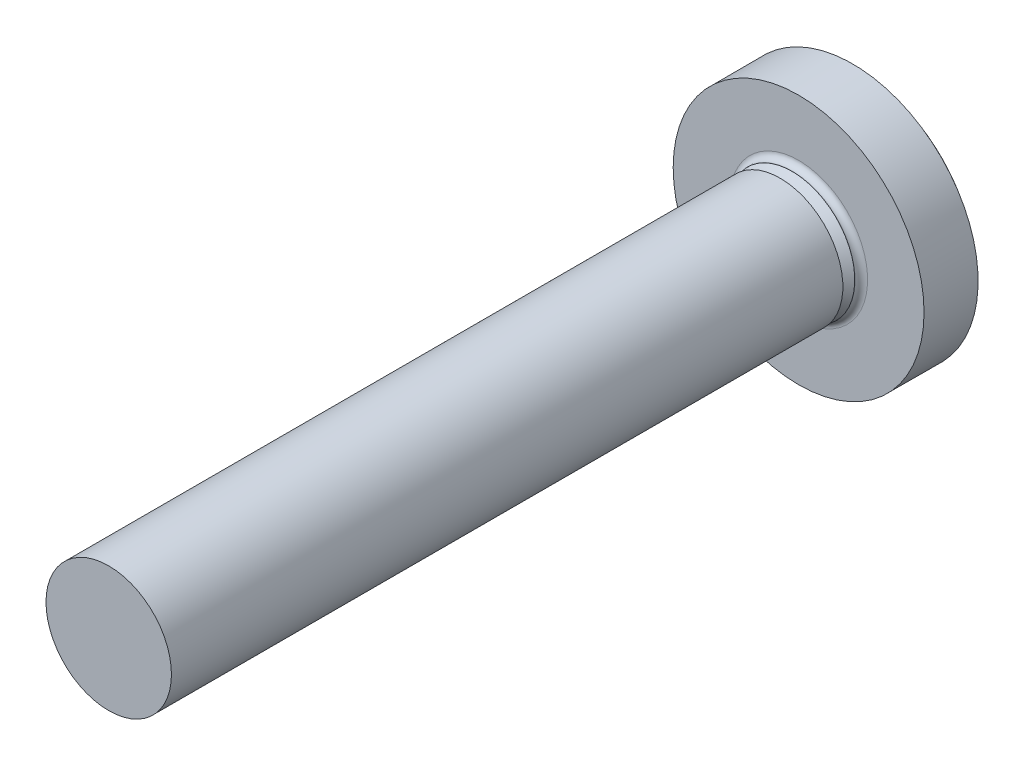
ISO-10303-21;
HEADER;
FILE_DESCRIPTION(('STEP AP214'),'2;1');
FILE_NAME('part.step','',(''),(''),'','','');
FILE_SCHEMA(('AUTOMOTIVE_DESIGN { 1 0 10303 214 1 1 1 1 }'));
ENDSEC;
DATA;
#1=APPLICATION_CONTEXT('core data for automotive mechanical design processes');
#2=APPLICATION_PROTOCOL_DEFINITION('international standard','automotive_design',2000,#1);
#3=PRODUCT_CONTEXT('',#1,'mechanical');
#4=PRODUCT('Part','Part','',(#3));
#5=PRODUCT_RELATED_PRODUCT_CATEGORY('part','',(#4));
#6=PRODUCT_DEFINITION_FORMATION('','',#4);
#7=PRODUCT_DEFINITION_CONTEXT('part definition',#1,'design');
#8=PRODUCT_DEFINITION('design','',#6,#7);
#9=PRODUCT_DEFINITION_SHAPE('','',#8);
#10=(LENGTH_UNIT() NAMED_UNIT(*) SI_UNIT(.MILLI.,.METRE.));
#11=(NAMED_UNIT(*) PLANE_ANGLE_UNIT() SI_UNIT($,.RADIAN.));
#12=(NAMED_UNIT(*) SI_UNIT($,.STERADIAN.) SOLID_ANGLE_UNIT());
#13=UNCERTAINTY_MEASURE_WITH_UNIT(LENGTH_MEASURE(1.E-05),#10,'distance_accuracy_value','');
#14=(GEOMETRIC_REPRESENTATION_CONTEXT(3) GLOBAL_UNCERTAINTY_ASSIGNED_CONTEXT((#13)) GLOBAL_UNIT_ASSIGNED_CONTEXT((#10,
#11,#12)) REPRESENTATION_CONTEXT('',''));
#15=CARTESIAN_POINT('',(0.,0.,0.));
#16=DIRECTION('',(0.,0.,1.));
#17=DIRECTION('',(1.,0.,0.));
#18=AXIS2_PLACEMENT_3D('',#15,#16,#17);
#19=CARTESIAN_POINT('',(0.,0.,0.));
#20=DIRECTION('',(0.,0.,-1.));
#21=DIRECTION('',(-1.,0.,0.));
#22=AXIS2_PLACEMENT_3D('',#19,#20,#21);
#23=CYLINDRICAL_SURFACE('',#22,2.);
#24=CARTESIAN_POINT('',(0.,0.,3.688875));
#25=DIRECTION('',(0.,0.,-1.));
#26=DIRECTION('',(-1.,0.,0.));
#27=AXIS2_PLACEMENT_3D('',#24,#25,#26);
#28=CIRCLE('',#27,2.);
#29=CARTESIAN_POINT('',(-2.,0.,3.688875));
#30=VERTEX_POINT('',#29);
#31=EDGE_CURVE('E204',#30,#30,#28,.T.);
#32=ORIENTED_EDGE('',*,*,#31,.F.);
#33=EDGE_LOOP('',(#32));
#34=FACE_BOUND('',#33,.T.);
#35=CARTESIAN_POINT('',(0.,0.,25.1));
#36=DIRECTION('',(0.,0.,1.));
#37=DIRECTION('',(1.,0.,0.));
#38=AXIS2_PLACEMENT_3D('',#35,#36,#37);
#39=CIRCLE('',#38,2.);
#40=CARTESIAN_POINT('',(2.,0.,25.1));
#41=VERTEX_POINT('',#40);
#42=EDGE_CURVE('E37',#41,#41,#39,.T.);
#43=ORIENTED_EDGE('',*,*,#42,.F.);
#44=EDGE_LOOP('',(#43));
#45=FACE_BOUND('',#44,.T.);
#46=ADVANCED_FACE('F34',(#34,#45),#23,.T.);
#47=CARTESIAN_POINT('',(0.,0.,6.5));
#48=DIRECTION('',(0.,0.,-1.));
#49=DIRECTION('',(0.,1.,0.));
#50=AXIS2_PLACEMENT_3D('',#47,#48,#49);
#51=SPHERICAL_SURFACE('',#50,6.5);
#52=CARTESIAN_POINT('',(0.,0.,1.3765246170202));
#53=DIRECTION('',(0.,0.,-1.));
#54=DIRECTION('',(-1.,0.,0.));
#55=AXIS2_PLACEMENT_3D('',#52,#53,#54);
#56=CIRCLE('',#55,4.);
#57=CARTESIAN_POINT('',(-4.,0.,1.3765246170202));
#58=VERTEX_POINT('',#57);
#59=EDGE_CURVE('E179',#58,#58,#56,.T.);
#60=ORIENTED_EDGE('',*,*,#59,.T.);
#61=EDGE_LOOP('',(#60));
#62=FACE_BOUND('',#61,.T.);
#63=CARTESIAN_POINT('',(-0.405545392562274,0.189108922281263,6.3801008200685));
#64=DIRECTION('',(-0.875426098065593,0.408217893676735,-0.258819045102521));
#65=DIRECTION('',(-0.422618261740699,-0.90630778703665,0.));
#66=AXIS2_PLACEMENT_3D('',#63,#64,#65);
#67=CIRCLE('',#66,6.48347090197349);
#68=CARTESIAN_POINT('',(0.92299563807694,-0.92299563807694,0.132413478861721));
#69=VERTEX_POINT('',#68);
#70=CARTESIAN_POINT('',(0.305622674506346,-2.10418012593627,0.35760463838069));
#71=VERTEX_POINT('',#70);
#72=EDGE_CURVE('E11',#69,#71,#67,.T.);
#73=ORIENTED_EDGE('',*,*,#72,.F.);
#74=CARTESIAN_POINT('',(-0.189108922281263,0.405545392562274,6.3801008200685));
#75=DIRECTION('',(-0.408217893676735,0.875426098065593,-0.258819045102521));
#76=DIRECTION('',(-0.90630778703665,-0.422618261740699,0.));
#77=AXIS2_PLACEMENT_3D('',#74,#75,#76);
#78=CIRCLE('',#77,6.48347090197349);
#79=CARTESIAN_POINT('',(2.10418012593627,-0.305622674506346,0.357604638380691));
#80=VERTEX_POINT('',#79);
#81=EDGE_CURVE('E43',#80,#69,#78,.T.);
#82=ORIENTED_EDGE('',*,*,#81,.F.);
#83=CARTESIAN_POINT('',(0.427627944162883,0.,6.61458256229943));
#84=DIRECTION('',(-0.965925826289068,0.,-0.258819045102521));
#85=DIRECTION('',(-0.258819045102521,0.,0.965925826289068));
#86=AXIS2_PLACEMENT_3D('',#83,#84,#85);
#87=CIRCLE('',#86,6.48490594980281);
#88=CARTESIAN_POINT('',(2.10418012593627,0.305622674506346,0.357604638380691));
#89=VERTEX_POINT('',#88);
#90=EDGE_CURVE('E235',#89,#80,#87,.T.);
#91=ORIENTED_EDGE('',*,*,#90,.F.);
#92=CARTESIAN_POINT('',(-0.189108922281263,-0.405545392562275,6.3801008200685));
#93=DIRECTION('',(-0.408217893676735,-0.875426098065593,-0.258819045102521));
#94=DIRECTION('',(0.90630778703665,-0.422618261740699,0.));
#95=AXIS2_PLACEMENT_3D('',#92,#93,#94);
#96=CIRCLE('',#95,6.48347090197349);
#97=CARTESIAN_POINT('',(0.922995638076941,0.922995638076939,0.132413478861721));
#98=VERTEX_POINT('',#97);
#99=EDGE_CURVE('E232',#98,#89,#96,.T.);
#100=ORIENTED_EDGE('',*,*,#99,.F.);
#101=CARTESIAN_POINT('',(-0.405545392562273,-0.189108922281263,6.3801008200685));
#102=DIRECTION('',(-0.875426098065593,-0.408217893676735,-0.258819045102521));
#103=DIRECTION('',(0.422618261740699,-0.90630778703665,0.));
#104=AXIS2_PLACEMENT_3D('',#101,#102,#103);
#105=CIRCLE('',#104,6.48347090197349);
#106=CARTESIAN_POINT('',(0.305622674506346,2.10418012593627,0.35760463838069));
#107=VERTEX_POINT('',#106);
#108=EDGE_CURVE('E229',#107,#98,#105,.T.);
#109=ORIENTED_EDGE('',*,*,#108,.F.);
#110=CARTESIAN_POINT('',(0.,0.427627944162883,6.61458256229943));
#111=DIRECTION('',(0.,-0.965925826289068,-0.258819045102521));
#112=DIRECTION('',(0.,0.258819045102521,-0.965925826289068));
#113=AXIS2_PLACEMENT_3D('',#110,#111,#112);
#114=CIRCLE('',#113,6.48490594980281);
#115=CARTESIAN_POINT('',(-0.305622674506345,2.10418012593627,0.35760463838069));
#116=VERTEX_POINT('',#115);
#117=EDGE_CURVE('E226',#116,#107,#114,.T.);
#118=ORIENTED_EDGE('',*,*,#117,.F.);
#119=CARTESIAN_POINT('',(0.405545392562275,-0.189108922281263,6.3801008200685));
#120=DIRECTION('',(0.875426098065593,-0.408217893676735,-0.258819045102521));
#121=DIRECTION('',(0.422618261740699,0.90630778703665,0.));
#122=AXIS2_PLACEMENT_3D('',#119,#120,#121);
#123=CIRCLE('',#122,6.48347090197349);
#124=CARTESIAN_POINT('',(-0.92299563807694,0.922995638076941,0.132413478861721));
#125=VERTEX_POINT('',#124);
#126=EDGE_CURVE('E223',#125,#116,#123,.T.);
#127=ORIENTED_EDGE('',*,*,#126,.F.);
#128=CARTESIAN_POINT('',(0.189108922281263,-0.405545392562273,6.3801008200685));
#129=DIRECTION('',(0.408217893676735,-0.875426098065593,-0.258819045102521));
#130=DIRECTION('',(0.90630778703665,0.422618261740699,0.));
#131=AXIS2_PLACEMENT_3D('',#128,#129,#130);
#132=CIRCLE('',#131,6.48347090197349);
#133=CARTESIAN_POINT('',(-2.10418012593627,0.305622674506346,0.35760463838069));
#134=VERTEX_POINT('',#133);
#135=EDGE_CURVE('E220',#134,#125,#132,.T.);
#136=ORIENTED_EDGE('',*,*,#135,.F.);
#137=CARTESIAN_POINT('',(-0.427627944162883,0.,6.61458256229943));
#138=DIRECTION('',(0.965925826289068,0.,-0.258819045102521));
#139=DIRECTION('',(-0.258819045102521,0.,-0.965925826289068));
#140=AXIS2_PLACEMENT_3D('',#137,#138,#139);
#141=CIRCLE('',#140,6.48490594980281);
#142=CARTESIAN_POINT('',(-2.10418012593627,-0.305622674506345,0.357604638380691));
#143=VERTEX_POINT('',#142);
#144=EDGE_CURVE('E217',#143,#134,#141,.T.);
#145=ORIENTED_EDGE('',*,*,#144,.F.);
#146=CARTESIAN_POINT('',(0.189108922281264,0.405545392562274,6.3801008200685));
#147=DIRECTION('',(0.408217893676735,0.875426098065593,-0.258819045102521));
#148=DIRECTION('',(-0.90630778703665,0.422618261740699,0.));
#149=AXIS2_PLACEMENT_3D('',#146,#147,#148);
#150=CIRCLE('',#149,6.48347090197349);
#151=CARTESIAN_POINT('',(-0.922995638076941,-0.92299563807694,0.132413478861721));
#152=VERTEX_POINT('',#151);
#153=EDGE_CURVE('E214',#152,#143,#150,.T.);
#154=ORIENTED_EDGE('',*,*,#153,.F.);
#155=CARTESIAN_POINT('',(0.405545392562273,0.189108922281263,6.3801008200685));
#156=DIRECTION('',(0.875426098065593,0.408217893676735,-0.258819045102521));
#157=DIRECTION('',(-0.422618261740699,0.90630778703665,0.));
#158=AXIS2_PLACEMENT_3D('',#155,#156,#157);
#159=CIRCLE('',#158,6.48347090197349);
#160=CARTESIAN_POINT('',(-0.305622674506346,-2.10418012593627,0.357604638380691));
#161=VERTEX_POINT('',#160);
#162=EDGE_CURVE('E211',#161,#152,#159,.T.);
#163=ORIENTED_EDGE('',*,*,#162,.F.);
#164=CARTESIAN_POINT('',(0.,-0.427627944162883,6.61458256229943));
#165=DIRECTION('',(0.,0.965925826289068,-0.258819045102521));
#166=DIRECTION('',(0.,0.258819045102521,0.965925826289068));
#167=AXIS2_PLACEMENT_3D('',#164,#165,#166);
#168=CIRCLE('',#167,6.48490594980281);
#169=EDGE_CURVE('E208',#71,#161,#168,.T.);
#170=ORIENTED_EDGE('',*,*,#169,.F.);
#171=EDGE_LOOP('',(#73,#82,#91,#100,#109,#118,#127,#136,#145,#154,#163,#170));
#172=FACE_BOUND('',#171,.T.);
#173=ADVANCED_FACE('F258',(#62,#172),#51,.T.);
#174=CARTESIAN_POINT('',(0.,2.,3.688875));
#175=DIRECTION('',(0.,0.,1.));
#176=DIRECTION('',(1.,0.,0.));
#177=AXIS2_PLACEMENT_3D('',#174,#175,#176);
#178=PLANE('',#177);
#179=CARTESIAN_POINT('',(0.,0.,3.688875));
#180=DIRECTION('',(0.,0.,-1.));
#181=DIRECTION('',(-1.,0.,0.));
#182=AXIS2_PLACEMENT_3D('',#179,#180,#181);
#183=CIRCLE('',#182,1.621125);
#184=CARTESIAN_POINT('',(-1.621125,0.,3.688875));
#185=VERTEX_POINT('',#184);
#186=EDGE_CURVE('E200',#185,#185,#183,.T.);
#187=ORIENTED_EDGE('',*,*,#186,.F.);
#188=EDGE_LOOP('',(#187));
#189=FACE_BOUND('',#188,.T.);
#190=ORIENTED_EDGE('',*,*,#31,.T.);
#191=EDGE_LOOP('',(#190));
#192=FACE_BOUND('',#191,.T.);
#193=ADVANCED_FACE('F253',(#189,#192),#178,.F.);
#194=CARTESIAN_POINT('',(0.,0.,3.688875));
#195=DIRECTION('',(0.,0.,-1.));
#196=DIRECTION('',(-1.,0.,0.));
#197=AXIS2_PLACEMENT_3D('',#194,#195,#196);
#198=CONICAL_SURFACE('',#197,1.621125,0.785398163397449);
#199=CARTESIAN_POINT('',(0.,0.,3.31));
#200=DIRECTION('',(0.,0.,-1.));
#201=DIRECTION('',(-1.,0.,0.));
#202=AXIS2_PLACEMENT_3D('',#199,#200,#201);
#203=CIRCLE('',#202,2.);
#204=CARTESIAN_POINT('',(-2.,0.,3.31));
#205=VERTEX_POINT('',#204);
#206=EDGE_CURVE('E196',#205,#205,#203,.T.);
#207=ORIENTED_EDGE('',*,*,#206,.F.);
#208=EDGE_LOOP('',(#207));
#209=FACE_BOUND('',#208,.T.);
#210=ORIENTED_EDGE('',*,*,#186,.T.);
#211=EDGE_LOOP('',(#210));
#212=FACE_BOUND('',#211,.T.);
#213=ADVANCED_FACE('F257',(#209,#212),#198,.T.);
#214=CARTESIAN_POINT('',(0.,0.,0.));
#215=DIRECTION('',(0.,0.,-1.));
#216=DIRECTION('',(-1.,0.,0.));
#217=AXIS2_PLACEMENT_3D('',#214,#215,#216);
#218=CYLINDRICAL_SURFACE('',#217,2.);
#219=CARTESIAN_POINT('',(0.,0.,3.3));
#220=DIRECTION('',(0.,0.,-1.));
#221=DIRECTION('',(-1.,0.,0.));
#222=AXIS2_PLACEMENT_3D('',#219,#220,#221);
#223=CIRCLE('',#222,2.);
#224=CARTESIAN_POINT('',(-2.,0.,3.3));
#225=VERTEX_POINT('',#224);
#226=EDGE_CURVE('E192',#225,#225,#223,.T.);
#227=ORIENTED_EDGE('',*,*,#226,.F.);
#228=EDGE_LOOP('',(#227));
#229=FACE_BOUND('',#228,.T.);
#230=ORIENTED_EDGE('',*,*,#206,.T.);
#231=EDGE_LOOP('',(#230));
#232=FACE_BOUND('',#231,.T.);
#233=ADVANCED_FACE('F267',(#229,#232),#218,.T.);
#234=CARTESIAN_POINT('',(0.,0.,3.3));
#235=DIRECTION('',(0.,0.,-1.));
#236=DIRECTION('',(-1.,0.,0.));
#237=AXIS2_PLACEMENT_3D('',#234,#235,#236);
#238=TOROIDAL_SURFACE('',#237,2.2,0.2);
#239=ORIENTED_EDGE('',*,*,#226,.T.);
#240=EDGE_LOOP('',(#239));
#241=FACE_BOUND('',#240,.T.);
#242=CARTESIAN_POINT('',(0.,0.,3.1));
#243=DIRECTION('',(0.,0.,-1.));
#244=DIRECTION('',(-1.,0.,0.));
#245=AXIS2_PLACEMENT_3D('',#242,#243,#244);
#246=CIRCLE('',#245,2.2);
#247=CARTESIAN_POINT('',(-2.2,0.,3.1));
#248=VERTEX_POINT('',#247);
#249=EDGE_CURVE('E188',#248,#248,#246,.T.);
#250=ORIENTED_EDGE('',*,*,#249,.F.);
#251=EDGE_LOOP('',(#250));
#252=FACE_BOUND('',#251,.T.);
#253=ADVANCED_FACE('F277',(#241,#252),#238,.F.);
#254=CARTESIAN_POINT('',(0.,2.2,3.1));
#255=DIRECTION('',(0.,0.,-1.));
#256=DIRECTION('',(-1.,0.,0.));
#257=AXIS2_PLACEMENT_3D('',#254,#255,#256);
#258=PLANE('',#257);
#259=CARTESIAN_POINT('',(0.,0.,3.1));
#260=DIRECTION('',(0.,0.,-1.));
#261=DIRECTION('',(-1.,0.,0.));
#262=AXIS2_PLACEMENT_3D('',#259,#260,#261);
#263=CIRCLE('',#262,4.);
#264=CARTESIAN_POINT('',(-4.,0.,3.1));
#265=VERTEX_POINT('',#264);
#266=EDGE_CURVE('E183',#265,#265,#263,.T.);
#267=ORIENTED_EDGE('',*,*,#266,.F.);
#268=EDGE_LOOP('',(#267));
#269=FACE_BOUND('',#268,.T.);
#270=ORIENTED_EDGE('',*,*,#249,.T.);
#271=EDGE_LOOP('',(#270));
#272=FACE_BOUND('',#271,.T.);
#273=ADVANCED_FACE('F287',(#269,#272),#258,.F.);
#274=CARTESIAN_POINT('',(0.,0.,0.));
#275=DIRECTION('',(0.,0.,-1.));
#276=DIRECTION('',(-1.,0.,0.));
#277=AXIS2_PLACEMENT_3D('',#274,#275,#276);
#278=CYLINDRICAL_SURFACE('',#277,4.);
#279=ORIENTED_EDGE('',*,*,#59,.F.);
#280=EDGE_LOOP('',(#279));
#281=FACE_BOUND('',#280,.T.);
#282=ORIENTED_EDGE('',*,*,#266,.T.);
#283=EDGE_LOOP('',(#282));
#284=FACE_BOUND('',#283,.T.);
#285=ADVANCED_FACE('F297',(#281,#284),#278,.T.);
#286=CARTESIAN_POINT('',(0.366666666666667,-2.2,0.));
#287=DIRECTION('',(-0.875426098065593,0.408217893676735,-0.258819045102521));
#288=DIRECTION('',(-0.422618261740699,-0.90630778703665,0.));
#289=AXIS2_PLACEMENT_3D('',#286,#287,#288);
#290=PLANE('',#289);
#291=ORIENTED_EDGE('',*,*,#72,.T.);
#292=DIRECTION('',(0.162689201767992,-0.255370893567974,-0.953057149569945));
#293=VECTOR('',#292,1.);
#294=CARTESIAN_POINT('',(0.366666666666667,-2.2,0.));
#295=LINE('',#294,#293);
#296=CARTESIAN_POINT('',(0.0423319890466869,-1.69089653438087,1.9));
#297=VERTEX_POINT('',#296);
#298=EDGE_CURVE('E50',#297,#71,#295,.T.);
#299=ORIENTED_EDGE('',*,*,#298,.F.);
#300=DIRECTION('',(0.422618261740699,0.90630778703665,0.));
#301=VECTOR('',#300,1.);
#302=CARTESIAN_POINT('',(0.149047069992156,-1.46204530477057,1.9));
#303=LINE('',#302,#301);
#304=CARTESIAN_POINT('',(0.566600049829658,-0.566600049829659,1.9));
#305=VERTEX_POINT('',#304);
#306=EDGE_CURVE('E136',#297,#305,#303,.T.);
#307=ORIENTED_EDGE('',*,*,#306,.T.);
#308=DIRECTION('',(0.193899607686987,-0.193899607686987,-0.961668281829896));
#309=VECTOR('',#308,1.);
#310=CARTESIAN_POINT('',(0.974781670177971,-0.974781670177972,-0.12442553751102));
#311=LINE('',#310,#309);
#312=EDGE_CURVE('E184',#305,#69,#311,.T.);
#313=ORIENTED_EDGE('',*,*,#312,.T.);
#314=EDGE_LOOP('',(#291,#299,#307,#313));
#315=FACE_BOUND('',#314,.T.);
#316=ADVANCED_FACE('F135',(#315),#290,.T.);
#317=CARTESIAN_POINT('',(0.949693951922647,-0.949693951922649,0.));
#318=DIRECTION('',(-0.408217893676735,0.875426098065593,-0.258819045102521));
#319=DIRECTION('',(-0.90630778703665,-0.422618261740699,0.));
#320=AXIS2_PLACEMENT_3D('',#317,#318,#319);
#321=PLANE('',#320);
#322=ORIENTED_EDGE('',*,*,#81,.T.);
#323=ORIENTED_EDGE('',*,*,#312,.F.);
#324=DIRECTION('',(0.90630778703665,0.422618261740699,0.));
#325=VECTOR('',#324,1.);
#326=CARTESIAN_POINT('',(0.177234242228863,-0.748164307737616,1.9));
#327=LINE('',#326,#325);
#328=CARTESIAN_POINT('',(1.69089653438087,-0.0423319890466872,1.9));
#329=VERTEX_POINT('',#328);
#330=EDGE_CURVE('E143',#305,#329,#327,.T.);
#331=ORIENTED_EDGE('',*,*,#330,.T.);
#332=DIRECTION('',(0.255370893567974,-0.162689201767992,-0.953057149569945));
#333=VECTOR('',#332,1.);
#334=CARTESIAN_POINT('',(2.2,-0.366666666666667,0.));
#335=LINE('',#334,#333);
#336=EDGE_CURVE('E558',#329,#80,#335,.T.);
#337=ORIENTED_EDGE('',*,*,#336,.T.);
#338=EDGE_LOOP('',(#322,#323,#331,#337));
#339=FACE_BOUND('',#338,.T.);
#340=ADVANCED_FACE('F315',(#339),#321,.T.);
#341=CARTESIAN_POINT('',(2.2,-0.366666666666667,0.));
#342=DIRECTION('',(-0.965925826289068,0.,-0.258819045102521));
#343=DIRECTION('',(-0.258819045102521,0.,0.965925826289068));
#344=AXIS2_PLACEMENT_3D('',#341,#342,#343);
#345=PLANE('',#344);
#346=ORIENTED_EDGE('',*,*,#90,.T.);
#347=ORIENTED_EDGE('',*,*,#336,.F.);
#348=DIRECTION('',(0.,1.,0.));
#349=VECTOR('',#348,1.);
#350=CARTESIAN_POINT('',(1.69089653438087,-1.67720172645669,1.9));
#351=LINE('',#350,#349);
#352=CARTESIAN_POINT('',(1.69089653438087,0.0423319890466869,1.9));
#353=VERTEX_POINT('',#352);
#354=EDGE_CURVE('E149',#329,#353,#351,.T.);
#355=ORIENTED_EDGE('',*,*,#354,.T.);
#356=DIRECTION('',(0.255370893567974,0.162689201767992,-0.953057149569945));
#357=VECTOR('',#356,1.);
#358=CARTESIAN_POINT('',(2.2,0.366666666666667,0.));
#359=LINE('',#358,#357);
#360=EDGE_CURVE('E555',#353,#89,#359,.T.);
#361=ORIENTED_EDGE('',*,*,#360,.T.);
#362=EDGE_LOOP('',(#346,#347,#355,#361));
#363=FACE_BOUND('',#362,.T.);
#364=ADVANCED_FACE('F328',(#363),#345,.T.);
#365=CARTESIAN_POINT('',(2.2,0.366666666666667,0.));
#366=DIRECTION('',(-0.408217893676735,-0.875426098065593,-0.258819045102521));
#367=DIRECTION('',(0.90630778703665,-0.422618261740699,0.));
#368=AXIS2_PLACEMENT_3D('',#365,#366,#367);
#369=PLANE('',#368);
#370=ORIENTED_EDGE('',*,*,#99,.T.);
#371=ORIENTED_EDGE('',*,*,#360,.F.);
#372=DIRECTION('',(-0.90630778703665,0.422618261740699,0.));
#373=VECTOR('',#372,1.);
#374=CARTESIAN_POINT('',(1.46204530477057,0.149047069992157,1.9));
#375=LINE('',#374,#373);
#376=CARTESIAN_POINT('',(0.566600049829659,0.566600049829658,1.9));
#377=VERTEX_POINT('',#376);
#378=EDGE_CURVE('E156',#353,#377,#375,.T.);
#379=ORIENTED_EDGE('',*,*,#378,.T.);
#380=DIRECTION('',(0.193899607686987,0.193899607686987,-0.961668281829896));
#381=VECTOR('',#380,1.);
#382=CARTESIAN_POINT('',(0.974781670177972,0.97478167017797,-0.12442553751102));
#383=LINE('',#382,#381);
#384=EDGE_CURVE('E552',#377,#98,#383,.T.);
#385=ORIENTED_EDGE('',*,*,#384,.T.);
#386=EDGE_LOOP('',(#370,#371,#379,#385));
#387=FACE_BOUND('',#386,.T.);
#388=ADVANCED_FACE('F338',(#387),#369,.T.);
#389=CARTESIAN_POINT('',(0.949693951922649,0.949693951922647,0.));
#390=DIRECTION('',(-0.875426098065593,-0.408217893676735,-0.258819045102521));
#391=DIRECTION('',(0.422618261740699,-0.90630778703665,0.));
#392=AXIS2_PLACEMENT_3D('',#389,#390,#391);
#393=PLANE('',#392);
#394=ORIENTED_EDGE('',*,*,#108,.T.);
#395=ORIENTED_EDGE('',*,*,#384,.F.);
#396=DIRECTION('',(-0.422618261740699,0.90630778703665,0.));
#397=VECTOR('',#396,1.);
#398=CARTESIAN_POINT('',(1.43385813253386,-1.29324091039736,1.9));
#399=LINE('',#398,#397);
#400=CARTESIAN_POINT('',(0.0423319890466871,1.69089653438087,1.9));
#401=VERTEX_POINT('',#400);
#402=EDGE_CURVE('E159',#377,#401,#399,.T.);
#403=ORIENTED_EDGE('',*,*,#402,.T.);
#404=DIRECTION('',(0.162689201767992,0.255370893567974,-0.953057149569945));
#405=VECTOR('',#404,1.);
#406=CARTESIAN_POINT('',(0.366666666666667,2.2,0.));
#407=LINE('',#406,#405);
#408=EDGE_CURVE('E549',#401,#107,#407,.T.);
#409=ORIENTED_EDGE('',*,*,#408,.T.);
#410=EDGE_LOOP('',(#394,#395,#403,#409));
#411=FACE_BOUND('',#410,.T.);
#412=ADVANCED_FACE('F350',(#411),#393,.T.);
#413=CARTESIAN_POINT('',(0.366666666666667,2.2,0.));
#414=DIRECTION('',(0.,-0.965925826289068,-0.258819045102521));
#415=DIRECTION('',(0.,0.258819045102521,-0.965925826289068));
#416=AXIS2_PLACEMENT_3D('',#413,#414,#415);
#417=PLANE('',#416);
#418=ORIENTED_EDGE('',*,*,#117,.T.);
#419=ORIENTED_EDGE('',*,*,#408,.F.);
#420=DIRECTION('',(-1.,0.,0.));
#421=VECTOR('',#420,1.);
#422=CARTESIAN_POINT('',(0.610451505290122,1.69089653438087,1.9));
#423=LINE('',#422,#421);
#424=CARTESIAN_POINT('',(-0.0423319890466866,1.69089653438087,1.9));
#425=VERTEX_POINT('',#424);
#426=EDGE_CURVE('E162',#401,#425,#423,.T.);
#427=ORIENTED_EDGE('',*,*,#426,.T.);
#428=DIRECTION('',(-0.162689201767992,0.255370893567974,-0.953057149569945));
#429=VECTOR('',#428,1.);
#430=CARTESIAN_POINT('',(-0.366666666666667,2.2,0.));
#431=LINE('',#430,#429);
#432=EDGE_CURVE('E546',#425,#116,#431,.T.);
#433=ORIENTED_EDGE('',*,*,#432,.T.);
#434=EDGE_LOOP('',(#418,#419,#427,#433));
#435=FACE_BOUND('',#434,.T.);
#436=ADVANCED_FACE('F362',(#435),#417,.T.);
#437=CARTESIAN_POINT('',(-0.366666666666667,2.2,0.));
#438=DIRECTION('',(0.875426098065593,-0.408217893676735,-0.258819045102521));
#439=DIRECTION('',(0.422618261740699,0.90630778703665,0.));
#440=AXIS2_PLACEMENT_3D('',#437,#438,#439);
#441=PLANE('',#440);
#442=ORIENTED_EDGE('',*,*,#126,.T.);
#443=ORIENTED_EDGE('',*,*,#432,.F.);
#444=DIRECTION('',(-0.422618261740699,-0.90630778703665,0.));
#445=VECTOR('',#444,1.);
#446=CARTESIAN_POINT('',(-1.21579729115873,-0.825607926976247,1.9));
#447=LINE('',#446,#445);
#448=CARTESIAN_POINT('',(-0.566600049829658,0.56660004982966,1.9));
#449=VERTEX_POINT('',#448);
#450=EDGE_CURVE('E165',#425,#449,#447,.T.);
#451=ORIENTED_EDGE('',*,*,#450,.T.);
#452=DIRECTION('',(-0.193899607686987,0.193899607686987,-0.961668281829896));
#453=VECTOR('',#452,1.);
#454=CARTESIAN_POINT('',(-0.97478167017797,0.974781670177972,-0.12442553751102));
#455=LINE('',#454,#453);
#456=EDGE_CURVE('E543',#449,#125,#455,.T.);
#457=ORIENTED_EDGE('',*,*,#456,.T.);
#458=EDGE_LOOP('',(#442,#443,#451,#457));
#459=FACE_BOUND('',#458,.T.);
#460=ADVANCED_FACE('F374',(#459),#441,.T.);
#461=CARTESIAN_POINT('',(-0.949693951922647,0.949693951922649,0.));
#462=DIRECTION('',(0.408217893676735,-0.875426098065593,-0.258819045102521));
#463=DIRECTION('',(0.90630778703665,0.422618261740699,0.));
#464=AXIS2_PLACEMENT_3D('',#461,#462,#463);
#465=PLANE('',#464);
#466=ORIENTED_EDGE('',*,*,#135,.T.);
#467=ORIENTED_EDGE('',*,*,#456,.F.);
#468=DIRECTION('',(-0.90630778703665,-0.422618261740699,0.));
#469=VECTOR('',#468,1.);
#470=CARTESIAN_POINT('',(-0.459203135565461,0.616680053413271,1.9));
#471=LINE('',#470,#469);
#472=CARTESIAN_POINT('',(-1.69089653438087,0.0423319890466875,1.9));
#473=VERTEX_POINT('',#472);
#474=EDGE_CURVE('E168',#449,#473,#471,.T.);
#475=ORIENTED_EDGE('',*,*,#474,.T.);
#476=DIRECTION('',(-0.255370893567974,0.162689201767992,-0.953057149569945));
#477=VECTOR('',#476,1.);
#478=CARTESIAN_POINT('',(-2.2,0.366666666666668,0.));
#479=LINE('',#478,#477);
#480=EDGE_CURVE('E540',#473,#134,#479,.T.);
#481=ORIENTED_EDGE('',*,*,#480,.T.);
#482=EDGE_LOOP('',(#466,#467,#475,#481));
#483=FACE_BOUND('',#482,.T.);
#484=ADVANCED_FACE('F386',(#483),#465,.T.);
#485=CARTESIAN_POINT('',(-2.2,0.366666666666668,0.));
#486=DIRECTION('',(0.965925826289068,0.,-0.258819045102521));
#487=DIRECTION('',(-0.258819045102521,0.,-0.965925826289068));
#488=AXIS2_PLACEMENT_3D('',#485,#486,#487);
#489=PLANE('',#488);
#490=ORIENTED_EDGE('',*,*,#144,.T.);
#491=ORIENTED_EDGE('',*,*,#480,.F.);
#492=DIRECTION('',(0.,-1.,0.));
#493=VECTOR('',#492,1.);
#494=CARTESIAN_POINT('',(-1.69089653438087,-1.67720172645669,1.9));
#495=LINE('',#494,#493);
#496=CARTESIAN_POINT('',(-1.69089653438087,-0.0423319890466864,1.9));
#497=VERTEX_POINT('',#496);
#498=EDGE_CURVE('E171',#473,#497,#495,.T.);
#499=ORIENTED_EDGE('',*,*,#498,.T.);
#500=DIRECTION('',(-0.255370893567974,-0.162689201767992,-0.953057149569945));
#501=VECTOR('',#500,1.);
#502=CARTESIAN_POINT('',(-2.2,-0.366666666666667,0.));
#503=LINE('',#502,#501);
#504=EDGE_CURVE('E535',#497,#143,#503,.T.);
#505=ORIENTED_EDGE('',*,*,#504,.T.);
#506=EDGE_LOOP('',(#490,#491,#499,#505));
#507=FACE_BOUND('',#506,.T.);
#508=ADVANCED_FACE('F398',(#507),#489,.T.);
#509=CARTESIAN_POINT('',(-2.2,-0.366666666666667,0.));
#510=DIRECTION('',(0.408217893676735,0.875426098065593,-0.258819045102521));
#511=DIRECTION('',(-0.90630778703665,0.422618261740699,0.));
#512=AXIS2_PLACEMENT_3D('',#509,#510,#511);
#513=PLANE('',#512);
#514=ORIENTED_EDGE('',*,*,#153,.T.);
#515=ORIENTED_EDGE('',*,*,#504,.F.);
#516=DIRECTION('',(0.90630778703665,-0.422618261740699,0.));
#517=VECTOR('',#516,1.);
#518=CARTESIAN_POINT('',(0.825607926976246,-1.21579729115873,1.9));
#519=LINE('',#518,#517);
#520=CARTESIAN_POINT('',(-0.56660004982966,-0.566600049829658,1.9));
#521=VERTEX_POINT('',#520);
#522=EDGE_CURVE('E174',#497,#521,#519,.T.);
#523=ORIENTED_EDGE('',*,*,#522,.T.);
#524=DIRECTION('',(-0.193899607686987,-0.193899607686987,-0.961668281829896));
#525=VECTOR('',#524,1.);
#526=CARTESIAN_POINT('',(-0.974781670177972,-0.97478167017797,-0.12442553751102));
#527=LINE('',#526,#525);
#528=EDGE_CURVE('E532',#521,#152,#527,.T.);
#529=ORIENTED_EDGE('',*,*,#528,.T.);
#530=EDGE_LOOP('',(#514,#515,#523,#529));
#531=FACE_BOUND('',#530,.T.);
#532=ADVANCED_FACE('F410',(#531),#513,.T.);
#533=CARTESIAN_POINT('',(-0.949693951922649,-0.949693951922647,0.));
#534=DIRECTION('',(0.875426098065593,0.408217893676735,-0.258819045102521));
#535=DIRECTION('',(-0.422618261740699,0.90630778703665,0.));
#536=AXIS2_PLACEMENT_3D('',#533,#534,#535);
#537=PLANE('',#536);
#538=ORIENTED_EDGE('',*,*,#162,.T.);
#539=ORIENTED_EDGE('',*,*,#528,.F.);
#540=DIRECTION('',(0.422618261740699,-0.90630778703665,0.));
#541=VECTOR('',#540,1.);
#542=CARTESIAN_POINT('',(0.0690137713829782,-1.92967828819168,1.9));
#543=LINE('',#542,#541);
#544=CARTESIAN_POINT('',(-0.0423319890466871,-1.69089653438087,1.9));
#545=VERTEX_POINT('',#544);
#546=EDGE_CURVE('E131',#521,#545,#543,.T.);
#547=ORIENTED_EDGE('',*,*,#546,.T.);
#548=DIRECTION('',(-0.162689201767992,-0.255370893567974,-0.953057149569945));
#549=VECTOR('',#548,1.);
#550=CARTESIAN_POINT('',(-0.366666666666667,-2.2,0.));
#551=LINE('',#550,#549);
#552=EDGE_CURVE('E126',#545,#161,#551,.T.);
#553=ORIENTED_EDGE('',*,*,#552,.T.);
#554=EDGE_LOOP('',(#538,#539,#547,#553));
#555=FACE_BOUND('',#554,.T.);
#556=ADVANCED_FACE('F422',(#555),#537,.T.);
#557=CARTESIAN_POINT('',(-0.366666666666667,-2.2,0.));
#558=DIRECTION('',(0.,0.965925826289068,-0.258819045102521));
#559=DIRECTION('',(0.,0.258819045102521,0.965925826289068));
#560=AXIS2_PLACEMENT_3D('',#557,#558,#559);
#561=PLANE('',#560);
#562=ORIENTED_EDGE('',*,*,#169,.T.);
#563=ORIENTED_EDGE('',*,*,#552,.F.);
#564=DIRECTION('',(1.,0.,0.));
#565=VECTOR('',#564,1.);
#566=CARTESIAN_POINT('',(0.610451505290122,-1.69089653438087,1.9));
#567=LINE('',#566,#565);
#568=EDGE_CURVE('E123',#545,#297,#567,.T.);
#569=ORIENTED_EDGE('',*,*,#568,.T.);
#570=ORIENTED_EDGE('',*,*,#298,.T.);
#571=EDGE_LOOP('',(#562,#563,#569,#570));
#572=FACE_BOUND('',#571,.T.);
#573=ADVANCED_FACE('F124',(#572),#561,.T.);
#574=CARTESIAN_POINT('',(0.610451505290122,-1.67720172645669,1.9));
#575=DIRECTION('',(0.,0.,-1.));
#576=DIRECTION('',(-1.,0.,0.));
#577=AXIS2_PLACEMENT_3D('',#574,#575,#576);
#578=PLANE('',#577);
#579=ORIENTED_EDGE('',*,*,#306,.F.);
#580=ORIENTED_EDGE('',*,*,#568,.F.);
#581=ORIENTED_EDGE('',*,*,#546,.F.);
#582=ORIENTED_EDGE('',*,*,#522,.F.);
#583=ORIENTED_EDGE('',*,*,#498,.F.);
#584=ORIENTED_EDGE('',*,*,#474,.F.);
#585=ORIENTED_EDGE('',*,*,#450,.F.);
#586=ORIENTED_EDGE('',*,*,#426,.F.);
#587=ORIENTED_EDGE('',*,*,#402,.F.);
#588=ORIENTED_EDGE('',*,*,#378,.F.);
#589=ORIENTED_EDGE('',*,*,#354,.F.);
#590=ORIENTED_EDGE('',*,*,#330,.F.);
#591=EDGE_LOOP('',(#579,#580,#581,#582,#583,#584,#585,#586,#587,#588,#589,#590));
#592=FACE_BOUND('',#591,.T.);
#593=ADVANCED_FACE('F141',(#592),#578,.T.);
#594=CARTESIAN_POINT('',(5.7959858537194,-10.,25.1));
#595=DIRECTION('',(0.,0.,1.));
#596=DIRECTION('',(1.,0.,0.));
#597=AXIS2_PLACEMENT_3D('',#594,#595,#596);
#598=PLANE('',#597);
#599=ORIENTED_EDGE('',*,*,#42,.T.);
#600=EDGE_LOOP('',(#599));
#601=FACE_BOUND('',#600,.T.);
#602=ADVANCED_FACE('F455',(#601),#598,.T.);
#603=CLOSED_SHELL('',(#46,#173,#193,#213,#233,#253,#273,#285,#316,#340,#364,#388,#412,#436,#460,
#484,#508,#532,#556,#573,#593,#602));
#604=MANIFOLD_SOLID_BREP('B2',#603);
#605=ADVANCED_BREP_SHAPE_REPRESENTATION('',(#18,#604),#14);
#606=SHAPE_DEFINITION_REPRESENTATION(#9,#605);
ENDSEC;
END-ISO-10303-21;
